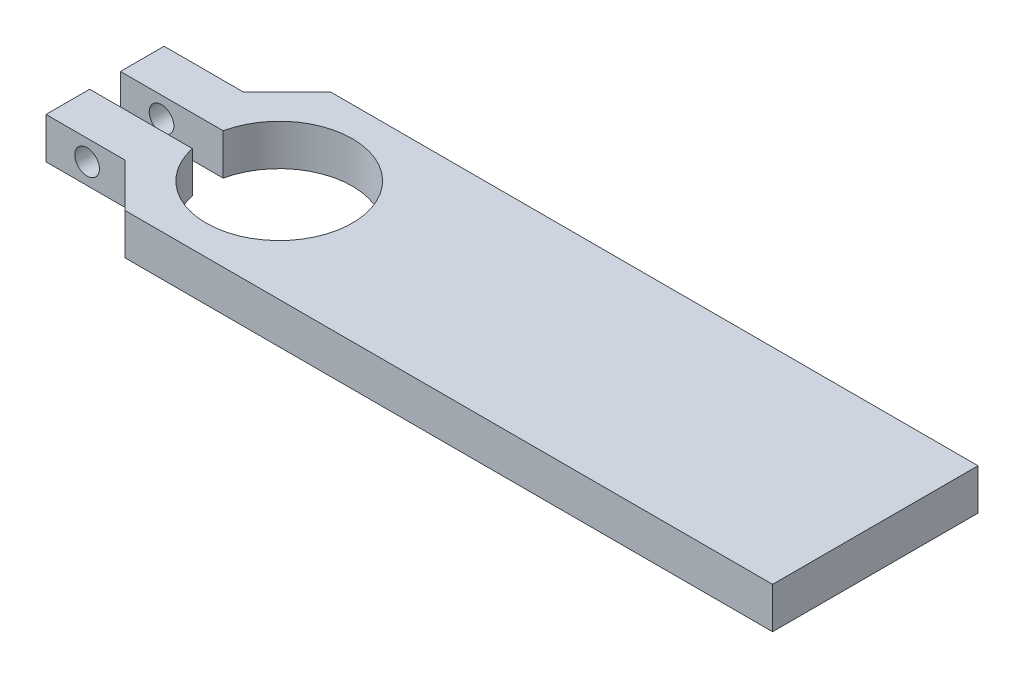
ISO-10303-21;
HEADER;
FILE_DESCRIPTION(('STEP AP214'),'2;1');
FILE_NAME('part.step','',(''),(''),'','','');
FILE_SCHEMA(('AUTOMOTIVE_DESIGN { 1 0 10303 214 1 1 1 1 }'));
ENDSEC;
DATA;
#1=APPLICATION_CONTEXT('core data for automotive mechanical design processes');
#2=APPLICATION_PROTOCOL_DEFINITION('international standard','automotive_design',2000,#1);
#3=PRODUCT_CONTEXT('',#1,'mechanical');
#4=PRODUCT('Part','Part','',(#3));
#5=PRODUCT_RELATED_PRODUCT_CATEGORY('part','',(#4));
#6=PRODUCT_DEFINITION_FORMATION('','',#4);
#7=PRODUCT_DEFINITION_CONTEXT('part definition',#1,'design');
#8=PRODUCT_DEFINITION('design','',#6,#7);
#9=PRODUCT_DEFINITION_SHAPE('','',#8);
#10=(LENGTH_UNIT() NAMED_UNIT(*) SI_UNIT(.MILLI.,.METRE.));
#11=(NAMED_UNIT(*) PLANE_ANGLE_UNIT() SI_UNIT($,.RADIAN.));
#12=(NAMED_UNIT(*) SI_UNIT($,.STERADIAN.) SOLID_ANGLE_UNIT());
#13=UNCERTAINTY_MEASURE_WITH_UNIT(LENGTH_MEASURE(1.E-05),#10,'distance_accuracy_value','');
#14=(GEOMETRIC_REPRESENTATION_CONTEXT(3) GLOBAL_UNCERTAINTY_ASSIGNED_CONTEXT((#13)) GLOBAL_UNIT_ASSIGNED_CONTEXT((#10,
#11,#12)) REPRESENTATION_CONTEXT('',''));
#15=CARTESIAN_POINT('',(0.,0.,0.));
#16=DIRECTION('',(0.,0.,1.));
#17=DIRECTION('',(1.,0.,0.));
#18=AXIS2_PLACEMENT_3D('',#15,#16,#17);
#19=CARTESIAN_POINT('',(0.,4.,0.));
#20=DIRECTION('',(1.,0.,0.));
#21=DIRECTION('',(0.,0.,-1.));
#22=AXIS2_PLACEMENT_3D('',#19,#20,#21);
#23=PLANE('',#22);
#24=DIRECTION('',(0.,0.,1.));
#25=VECTOR('',#24,1.);
#26=CARTESIAN_POINT('',(0.,0.,0.));
#27=LINE('',#26,#25);
#28=CARTESIAN_POINT('',(0.,0.,-8.5));
#29=VERTEX_POINT('',#28);
#30=CARTESIAN_POINT('',(0.,0.,-4.25));
#31=VERTEX_POINT('',#30);
#32=EDGE_CURVE('E159',#29,#31,#27,.T.);
#33=ORIENTED_EDGE('',*,*,#32,.T.);
#34=DIRECTION('',(0.,1.,0.));
#35=VECTOR('',#34,1.);
#36=CARTESIAN_POINT('',(0.,0.,-4.25));
#37=LINE('',#36,#35);
#38=CARTESIAN_POINT('',(0.,4.,-4.25));
#39=VERTEX_POINT('',#38);
#40=EDGE_CURVE('E223',#31,#39,#37,.T.);
#41=ORIENTED_EDGE('',*,*,#40,.T.);
#42=DIRECTION('',(0.,0.,1.));
#43=VECTOR('',#42,1.);
#44=CARTESIAN_POINT('',(0.,4.,0.));
#45=LINE('',#44,#43);
#46=CARTESIAN_POINT('',(0.,4.,-8.5));
#47=VERTEX_POINT('',#46);
#48=EDGE_CURVE('E177',#47,#39,#45,.T.);
#49=ORIENTED_EDGE('',*,*,#48,.F.);
#50=DIRECTION('',(0.,-1.,0.));
#51=VECTOR('',#50,1.);
#52=CARTESIAN_POINT('',(0.,4.000012,-8.5));
#53=LINE('',#52,#51);
#54=EDGE_CURVE('E186',#47,#29,#53,.T.);
#55=ORIENTED_EDGE('',*,*,#54,.T.);
#56=EDGE_LOOP('',(#33,#41,#49,#55));
#57=FACE_BOUND('',#56,.T.);
#58=ADVANCED_FACE('F39',(#57),#23,.F.);
#59=CARTESIAN_POINT('',(0.,4.,-15.75));
#60=VERTEX_POINT('',#59);
#61=CARTESIAN_POINT('',(0.,4.,-11.5));
#62=VERTEX_POINT('',#61);
#63=EDGE_CURVE('E150',#60,#62,#45,.T.);
#64=ORIENTED_EDGE('',*,*,#63,.F.);
#65=DIRECTION('',(0.,1.,0.));
#66=VECTOR('',#65,1.);
#67=CARTESIAN_POINT('',(0.,0.,-15.75));
#68=LINE('',#67,#66);
#69=CARTESIAN_POINT('',(0.,0.,-15.75));
#70=VERTEX_POINT('',#69);
#71=EDGE_CURVE('E134',#70,#60,#68,.T.);
#72=ORIENTED_EDGE('',*,*,#71,.F.);
#73=CARTESIAN_POINT('',(0.,0.,-11.5));
#74=VERTEX_POINT('',#73);
#75=EDGE_CURVE('E148',#70,#74,#27,.T.);
#76=ORIENTED_EDGE('',*,*,#75,.T.);
#77=DIRECTION('',(0.,-1.,0.));
#78=VECTOR('',#77,1.);
#79=CARTESIAN_POINT('',(0.,4.000012,-11.5));
#80=LINE('',#79,#78);
#81=EDGE_CURVE('E252',#62,#74,#80,.T.);
#82=ORIENTED_EDGE('',*,*,#81,.F.);
#83=EDGE_LOOP('',(#64,#72,#76,#82));
#84=FACE_BOUND('',#83,.T.);
#85=ADVANCED_FACE('F146',(#84),#23,.F.);
#86=CARTESIAN_POINT('',(0.,4.,0.));
#87=DIRECTION('',(0.,-1.,0.));
#88=DIRECTION('',(0.,0.,-1.));
#89=AXIS2_PLACEMENT_3D('',#86,#87,#88);
#90=PLANE('',#89);
#91=DIRECTION('',(-1.,0.,0.));
#92=VECTOR('',#91,1.);
#93=CARTESIAN_POINT('',(0.,4.,-20.));
#94=LINE('',#93,#92);
#95=CARTESIAN_POINT('',(75.,4.,-20.));
#96=VERTEX_POINT('',#95);
#97=CARTESIAN_POINT('',(11.9412531141164,4.,-20.));
#98=VERTEX_POINT('',#97);
#99=EDGE_CURVE('E168',#96,#98,#94,.T.);
#100=ORIENTED_EDGE('',*,*,#99,.T.);
#101=DIRECTION('',(0.707106781186547,0.,-0.707106781186548));
#102=VECTOR('',#101,1.);
#103=CARTESIAN_POINT('',(7.69125311411642,4.,-15.75));
#104=LINE('',#103,#102);
#105=CARTESIAN_POINT('',(7.69125311411642,4.,-15.75));
#106=VERTEX_POINT('',#105);
#107=EDGE_CURVE('E64',#106,#98,#104,.T.);
#108=ORIENTED_EDGE('',*,*,#107,.F.);
#109=DIRECTION('',(1.,0.,0.));
#110=VECTOR('',#109,1.);
#111=CARTESIAN_POINT('',(0.,4.,-15.75));
#112=LINE('',#111,#110);
#113=EDGE_CURVE('E227',#60,#106,#112,.T.);
#114=ORIENTED_EDGE('',*,*,#113,.F.);
#115=ORIENTED_EDGE('',*,*,#63,.T.);
#116=DIRECTION('',(-1.,0.,0.));
#117=VECTOR('',#116,1.);
#118=CARTESIAN_POINT('',(0.,4.,-11.5));
#119=LINE('',#118,#117);
#120=CARTESIAN_POINT('',(10.,4.,-11.5));
#121=VERTEX_POINT('',#120);
#122=EDGE_CURVE('E185',#121,#62,#119,.T.);
#123=ORIENTED_EDGE('',*,*,#122,.F.);
#124=CARTESIAN_POINT('',(16.9602011465187,4.,-10.));
#125=DIRECTION('',(0.,1.,0.));
#126=DIRECTION('',(0.,0.,1.));
#127=AXIS2_PLACEMENT_3D('',#124,#125,#126);
#128=CIRCLE('',#127,7.12);
#129=CARTESIAN_POINT('',(10.,4.,-8.5));
#130=VERTEX_POINT('',#129);
#131=EDGE_CURVE('E181',#130,#121,#128,.T.);
#132=ORIENTED_EDGE('',*,*,#131,.F.);
#133=DIRECTION('',(1.,0.,0.));
#134=VECTOR('',#133,1.);
#135=CARTESIAN_POINT('',(0.,4.,-8.5));
#136=LINE('',#135,#134);
#137=EDGE_CURVE('E166',#47,#130,#136,.T.);
#138=ORIENTED_EDGE('',*,*,#137,.F.);
#139=ORIENTED_EDGE('',*,*,#48,.T.);
#140=DIRECTION('',(-1.,0.,0.));
#141=VECTOR('',#140,1.);
#142=CARTESIAN_POINT('',(0.,4.,-4.25));
#143=LINE('',#142,#141);
#144=CARTESIAN_POINT('',(7.69125311411642,4.,-4.25));
#145=VERTEX_POINT('',#144);
#146=EDGE_CURVE('E212',#145,#39,#143,.T.);
#147=ORIENTED_EDGE('',*,*,#146,.F.);
#148=DIRECTION('',(-0.707106781186547,0.,-0.707106781186548));
#149=VECTOR('',#148,1.);
#150=CARTESIAN_POINT('',(7.69125311411642,4.,-4.25));
#151=LINE('',#150,#149);
#152=CARTESIAN_POINT('',(11.9412531141164,4.,0.));
#153=VERTEX_POINT('',#152);
#154=EDGE_CURVE('E217',#153,#145,#151,.T.);
#155=ORIENTED_EDGE('',*,*,#154,.F.);
#156=DIRECTION('',(1.,0.,0.));
#157=VECTOR('',#156,1.);
#158=CARTESIAN_POINT('',(0.,4.,0.));
#159=LINE('',#158,#157);
#160=CARTESIAN_POINT('',(75.,4.,0.));
#161=VERTEX_POINT('',#160);
#162=EDGE_CURVE('E265',#153,#161,#159,.T.);
#163=ORIENTED_EDGE('',*,*,#162,.T.);
#164=DIRECTION('',(0.,0.,-1.));
#165=VECTOR('',#164,1.);
#166=CARTESIAN_POINT('',(75.,4.,0.));
#167=LINE('',#166,#165);
#168=EDGE_CURVE('E267',#161,#96,#167,.T.);
#169=ORIENTED_EDGE('',*,*,#168,.T.);
#170=EDGE_LOOP('',(#100,#108,#114,#115,#123,#132,#138,#139,#147,#155,#163,#169));
#171=FACE_BOUND('',#170,.T.);
#172=ADVANCED_FACE('F273',(#171),#90,.F.);
#173=CARTESIAN_POINT('',(0.,0.,0.));
#174=DIRECTION('',(0.,-1.,0.));
#175=DIRECTION('',(0.,0.,-1.));
#176=AXIS2_PLACEMENT_3D('',#173,#174,#175);
#177=PLANE('',#176);
#178=DIRECTION('',(0.707106781186547,0.,-0.707106781186548));
#179=VECTOR('',#178,1.);
#180=CARTESIAN_POINT('',(7.69125311411642,0.,-15.75));
#181=LINE('',#180,#179);
#182=CARTESIAN_POINT('',(7.69125311411642,0.,-15.75));
#183=VERTEX_POINT('',#182);
#184=CARTESIAN_POINT('',(11.9412531141164,0.,-20.));
#185=VERTEX_POINT('',#184);
#186=EDGE_CURVE('E142',#183,#185,#181,.T.);
#187=ORIENTED_EDGE('',*,*,#186,.T.);
#188=DIRECTION('',(-1.,0.,0.));
#189=VECTOR('',#188,1.);
#190=CARTESIAN_POINT('',(0.,0.,-20.));
#191=LINE('',#190,#189);
#192=CARTESIAN_POINT('',(75.,0.,-20.));
#193=VERTEX_POINT('',#192);
#194=EDGE_CURVE('E173',#193,#185,#191,.T.);
#195=ORIENTED_EDGE('',*,*,#194,.F.);
#196=DIRECTION('',(0.,0.,-1.));
#197=VECTOR('',#196,1.);
#198=CARTESIAN_POINT('',(75.,0.,0.));
#199=LINE('',#198,#197);
#200=CARTESIAN_POINT('',(75.,0.,0.));
#201=VERTEX_POINT('',#200);
#202=EDGE_CURVE('E163',#201,#193,#199,.T.);
#203=ORIENTED_EDGE('',*,*,#202,.F.);
#204=DIRECTION('',(1.,0.,0.));
#205=VECTOR('',#204,1.);
#206=CARTESIAN_POINT('',(0.,0.,0.));
#207=LINE('',#206,#205);
#208=CARTESIAN_POINT('',(11.9412531141164,0.,0.));
#209=VERTEX_POINT('',#208);
#210=EDGE_CURVE('E158',#209,#201,#207,.T.);
#211=ORIENTED_EDGE('',*,*,#210,.F.);
#212=DIRECTION('',(-0.707106781186547,0.,-0.707106781186548));
#213=VECTOR('',#212,1.);
#214=CARTESIAN_POINT('',(7.69125311411642,0.,-4.25));
#215=LINE('',#214,#213);
#216=CARTESIAN_POINT('',(7.69125311411642,0.,-4.25));
#217=VERTEX_POINT('',#216);
#218=EDGE_CURVE('E56',#209,#217,#215,.T.);
#219=ORIENTED_EDGE('',*,*,#218,.T.);
#220=DIRECTION('',(-1.,0.,0.));
#221=VECTOR('',#220,1.);
#222=CARTESIAN_POINT('',(0.,0.,-4.25));
#223=LINE('',#222,#221);
#224=EDGE_CURVE('E211',#217,#31,#223,.T.);
#225=ORIENTED_EDGE('',*,*,#224,.T.);
#226=ORIENTED_EDGE('',*,*,#32,.F.);
#227=DIRECTION('',(1.,0.,0.));
#228=VECTOR('',#227,1.);
#229=CARTESIAN_POINT('',(0.,0.,-8.5));
#230=LINE('',#229,#228);
#231=CARTESIAN_POINT('',(10.,0.,-8.5));
#232=VERTEX_POINT('',#231);
#233=EDGE_CURVE('E236',#29,#232,#230,.T.);
#234=ORIENTED_EDGE('',*,*,#233,.T.);
#235=CARTESIAN_POINT('',(16.9602011465187,0.,-10.));
#236=DIRECTION('',(0.,1.,0.));
#237=DIRECTION('',(0.,0.,-1.));
#238=AXIS2_PLACEMENT_3D('',#235,#236,#237);
#239=CIRCLE('',#238,7.12);
#240=CARTESIAN_POINT('',(10.,0.,-11.5));
#241=VERTEX_POINT('',#240);
#242=EDGE_CURVE('E240',#232,#241,#239,.T.);
#243=ORIENTED_EDGE('',*,*,#242,.T.);
#244=DIRECTION('',(-1.,0.,0.));
#245=VECTOR('',#244,1.);
#246=CARTESIAN_POINT('',(0.,0.,-11.5));
#247=LINE('',#246,#245);
#248=EDGE_CURVE('E156',#241,#74,#247,.T.);
#249=ORIENTED_EDGE('',*,*,#248,.T.);
#250=ORIENTED_EDGE('',*,*,#75,.F.);
#251=DIRECTION('',(1.,0.,0.));
#252=VECTOR('',#251,1.);
#253=CARTESIAN_POINT('',(0.,0.,-15.75));
#254=LINE('',#253,#252);
#255=EDGE_CURVE('E129',#70,#183,#254,.T.);
#256=ORIENTED_EDGE('',*,*,#255,.T.);
#257=EDGE_LOOP('',(#187,#195,#203,#211,#219,#225,#226,#234,#243,#249,#250,#256));
#258=FACE_BOUND('',#257,.T.);
#259=ADVANCED_FACE('F154',(#258),#177,.T.);
#260=CARTESIAN_POINT('',(0.,4.,0.));
#261=DIRECTION('',(0.,0.,-1.));
#262=DIRECTION('',(-1.,0.,0.));
#263=AXIS2_PLACEMENT_3D('',#260,#261,#262);
#264=PLANE('',#263);
#265=ORIENTED_EDGE('',*,*,#162,.F.);
#266=DIRECTION('',(0.,1.,0.));
#267=VECTOR('',#266,1.);
#268=CARTESIAN_POINT('',(11.9412531141164,0.,0.));
#269=LINE('',#268,#267);
#270=EDGE_CURVE('E216',#209,#153,#269,.T.);
#271=ORIENTED_EDGE('',*,*,#270,.F.);
#272=ORIENTED_EDGE('',*,*,#210,.T.);
#273=DIRECTION('',(0.,-1.,0.));
#274=VECTOR('',#273,1.);
#275=CARTESIAN_POINT('',(75.,4.,0.));
#276=LINE('',#275,#274);
#277=EDGE_CURVE('E11',#161,#201,#276,.T.);
#278=ORIENTED_EDGE('',*,*,#277,.F.);
#279=EDGE_LOOP('',(#265,#271,#272,#278));
#280=FACE_BOUND('',#279,.T.);
#281=ADVANCED_FACE('F306',(#280),#264,.F.);
#282=CARTESIAN_POINT('',(75.,4.,0.));
#283=DIRECTION('',(-1.,0.,0.));
#284=DIRECTION('',(0.,0.,1.));
#285=AXIS2_PLACEMENT_3D('',#282,#283,#284);
#286=PLANE('',#285);
#287=ORIENTED_EDGE('',*,*,#202,.T.);
#288=DIRECTION('',(0.,-1.,0.));
#289=VECTOR('',#288,1.);
#290=CARTESIAN_POINT('',(75.,4.,-20.));
#291=LINE('',#290,#289);
#292=EDGE_CURVE('E48',#96,#193,#291,.T.);
#293=ORIENTED_EDGE('',*,*,#292,.F.);
#294=ORIENTED_EDGE('',*,*,#168,.F.);
#295=ORIENTED_EDGE('',*,*,#277,.T.);
#296=EDGE_LOOP('',(#287,#293,#294,#295));
#297=FACE_BOUND('',#296,.T.);
#298=ADVANCED_FACE('F307',(#297),#286,.F.);
#299=CARTESIAN_POINT('',(0.,4.,-20.));
#300=DIRECTION('',(0.,0.,1.));
#301=DIRECTION('',(1.,0.,0.));
#302=AXIS2_PLACEMENT_3D('',#299,#300,#301);
#303=PLANE('',#302);
#304=ORIENTED_EDGE('',*,*,#194,.T.);
#305=DIRECTION('',(0.,1.,0.));
#306=VECTOR('',#305,1.);
#307=CARTESIAN_POINT('',(11.9412531141164,0.,-20.));
#308=LINE('',#307,#306);
#309=EDGE_CURVE('E194',#185,#98,#308,.T.);
#310=ORIENTED_EDGE('',*,*,#309,.T.);
#311=ORIENTED_EDGE('',*,*,#99,.F.);
#312=ORIENTED_EDGE('',*,*,#292,.T.);
#313=EDGE_LOOP('',(#304,#310,#311,#312));
#314=FACE_BOUND('',#313,.T.);
#315=ADVANCED_FACE('F274',(#314),#303,.F.);
#316=CARTESIAN_POINT('',(0.,4.000012,-8.5));
#317=DIRECTION('',(0.,0.,-1.));
#318=DIRECTION('',(-1.,0.,0.));
#319=AXIS2_PLACEMENT_3D('',#316,#317,#318);
#320=PLANE('',#319);
#321=CARTESIAN_POINT('',(4.,2.,-8.5));
#322=DIRECTION('',(0.,0.,-1.));
#323=DIRECTION('',(-1.,0.,0.));
#324=AXIS2_PLACEMENT_3D('',#321,#322,#323);
#325=CIRCLE('',#324,1.2);
#326=CARTESIAN_POINT('',(2.8,2.,-8.5));
#327=VERTEX_POINT('',#326);
#328=EDGE_CURVE('E190',#327,#327,#325,.T.);
#329=ORIENTED_EDGE('',*,*,#328,.F.);
#330=EDGE_LOOP('',(#329));
#331=FACE_BOUND('',#330,.T.);
#332=ORIENTED_EDGE('',*,*,#137,.T.);
#333=DIRECTION('',(0.,1.,0.));
#334=VECTOR('',#333,1.);
#335=CARTESIAN_POINT('',(10.,0.,-8.5));
#336=LINE('',#335,#334);
#337=EDGE_CURVE('E245',#232,#130,#336,.T.);
#338=ORIENTED_EDGE('',*,*,#337,.F.);
#339=ORIENTED_EDGE('',*,*,#233,.F.);
#340=ORIENTED_EDGE('',*,*,#54,.F.);
#341=EDGE_LOOP('',(#332,#338,#339,#340));
#342=FACE_BOUND('',#341,.T.);
#343=ADVANCED_FACE('F314',(#331,#342),#320,.T.);
#344=CARTESIAN_POINT('',(0.,4.000012,-11.5));
#345=DIRECTION('',(0.,0.,1.));
#346=DIRECTION('',(1.,0.,0.));
#347=AXIS2_PLACEMENT_3D('',#344,#345,#346);
#348=PLANE('',#347);
#349=CARTESIAN_POINT('',(4.,2.,-11.5));
#350=DIRECTION('',(0.,0.,1.));
#351=DIRECTION('',(1.,0.,0.));
#352=AXIS2_PLACEMENT_3D('',#349,#350,#351);
#353=CIRCLE('',#352,1.2);
#354=CARTESIAN_POINT('',(5.2,2.,-11.5));
#355=VERTEX_POINT('',#354);
#356=EDGE_CURVE('E187',#355,#355,#353,.T.);
#357=ORIENTED_EDGE('',*,*,#356,.F.);
#358=EDGE_LOOP('',(#357));
#359=FACE_BOUND('',#358,.T.);
#360=ORIENTED_EDGE('',*,*,#122,.T.);
#361=ORIENTED_EDGE('',*,*,#81,.T.);
#362=ORIENTED_EDGE('',*,*,#248,.F.);
#363=DIRECTION('',(0.,1.,0.));
#364=VECTOR('',#363,1.);
#365=CARTESIAN_POINT('',(10.,0.,-11.5));
#366=LINE('',#365,#364);
#367=EDGE_CURVE('E249',#241,#121,#366,.T.);
#368=ORIENTED_EDGE('',*,*,#367,.T.);
#369=EDGE_LOOP('',(#360,#361,#362,#368));
#370=FACE_BOUND('',#369,.T.);
#371=ADVANCED_FACE('F286',(#359,#370),#348,.T.);
#372=CARTESIAN_POINT('',(16.9602011465187,0.,-10.));
#373=DIRECTION('',(0.,1.,0.));
#374=DIRECTION('',(0.,0.,1.));
#375=AXIS2_PLACEMENT_3D('',#372,#373,#374);
#376=CYLINDRICAL_SURFACE('',#375,7.12);
#377=ORIENTED_EDGE('',*,*,#367,.F.);
#378=ORIENTED_EDGE('',*,*,#242,.F.);
#379=ORIENTED_EDGE('',*,*,#337,.T.);
#380=ORIENTED_EDGE('',*,*,#131,.T.);
#381=EDGE_LOOP('',(#377,#378,#379,#380));
#382=FACE_BOUND('',#381,.T.);
#383=ADVANCED_FACE('F290',(#382),#376,.F.);
#384=CARTESIAN_POINT('',(4.,2.,-20.));
#385=DIRECTION('',(0.,0.,-1.));
#386=DIRECTION('',(-1.,0.,0.));
#387=AXIS2_PLACEMENT_3D('',#384,#385,#386);
#388=CYLINDRICAL_SURFACE('',#387,1.2);
#389=CARTESIAN_POINT('',(4.,2.,-15.75));
#390=DIRECTION('',(0.,0.,1.));
#391=DIRECTION('',(1.,0.,0.));
#392=AXIS2_PLACEMENT_3D('',#389,#390,#391);
#393=CIRCLE('',#392,1.2);
#394=CARTESIAN_POINT('',(5.2,2.,-15.75));
#395=VERTEX_POINT('',#394);
#396=EDGE_CURVE('E42',#395,#395,#393,.F.);
#397=ORIENTED_EDGE('',*,*,#396,.T.);
#398=EDGE_LOOP('',(#397));
#399=FACE_BOUND('',#398,.T.);
#400=ORIENTED_EDGE('',*,*,#356,.T.);
#401=EDGE_LOOP('',(#400));
#402=FACE_BOUND('',#401,.T.);
#403=ADVANCED_FACE('F337',(#399,#402),#388,.F.);
#404=CARTESIAN_POINT('',(4.,2.,-4.25));
#405=DIRECTION('',(0.,0.,-1.));
#406=DIRECTION('',(-1.,0.,0.));
#407=AXIS2_PLACEMENT_3D('',#404,#405,#406);
#408=CIRCLE('',#407,1.2);
#409=CARTESIAN_POINT('',(2.8,2.,-4.25));
#410=VERTEX_POINT('',#409);
#411=EDGE_CURVE('E191',#410,#410,#408,.F.);
#412=ORIENTED_EDGE('',*,*,#411,.T.);
#413=EDGE_LOOP('',(#412));
#414=FACE_BOUND('',#413,.T.);
#415=ORIENTED_EDGE('',*,*,#328,.T.);
#416=EDGE_LOOP('',(#415));
#417=FACE_BOUND('',#416,.T.);
#418=ADVANCED_FACE('F340',(#414,#417),#388,.F.);
#419=CARTESIAN_POINT('',(0.,0.,-4.25));
#420=DIRECTION('',(0.,0.,-1.));
#421=DIRECTION('',(-1.,0.,0.));
#422=AXIS2_PLACEMENT_3D('',#419,#420,#421);
#423=PLANE('',#422);
#424=ORIENTED_EDGE('',*,*,#146,.T.);
#425=ORIENTED_EDGE('',*,*,#40,.F.);
#426=ORIENTED_EDGE('',*,*,#224,.F.);
#427=DIRECTION('',(0.,1.,0.));
#428=VECTOR('',#427,1.);
#429=CARTESIAN_POINT('',(7.69125311411642,0.,-4.25));
#430=LINE('',#429,#428);
#431=EDGE_CURVE('E228',#217,#145,#430,.T.);
#432=ORIENTED_EDGE('',*,*,#431,.T.);
#433=EDGE_LOOP('',(#424,#425,#426,#432));
#434=FACE_BOUND('',#433,.T.);
#435=ORIENTED_EDGE('',*,*,#411,.F.);
#436=EDGE_LOOP('',(#435));
#437=FACE_BOUND('',#436,.T.);
#438=ADVANCED_FACE('F301',(#434,#437),#423,.F.);
#439=CARTESIAN_POINT('',(7.69125311411642,0.,-4.25));
#440=DIRECTION('',(0.707106781186548,0.,-0.707106781186547));
#441=DIRECTION('',(-0.707106781186547,0.,-0.707106781186548));
#442=AXIS2_PLACEMENT_3D('',#439,#440,#441);
#443=PLANE('',#442);
#444=ORIENTED_EDGE('',*,*,#154,.T.);
#445=ORIENTED_EDGE('',*,*,#431,.F.);
#446=ORIENTED_EDGE('',*,*,#218,.F.);
#447=ORIENTED_EDGE('',*,*,#270,.T.);
#448=EDGE_LOOP('',(#444,#445,#446,#447));
#449=FACE_BOUND('',#448,.T.);
#450=ADVANCED_FACE('F342',(#449),#443,.F.);
#451=CARTESIAN_POINT('',(0.,0.,-15.75));
#452=DIRECTION('',(0.,0.,1.));
#453=DIRECTION('',(1.,0.,0.));
#454=AXIS2_PLACEMENT_3D('',#451,#452,#453);
#455=PLANE('',#454);
#456=ORIENTED_EDGE('',*,*,#113,.T.);
#457=DIRECTION('',(0.,1.,0.));
#458=VECTOR('',#457,1.);
#459=CARTESIAN_POINT('',(7.69125311411642,0.,-15.75));
#460=LINE('',#459,#458);
#461=EDGE_CURVE('E136',#183,#106,#460,.T.);
#462=ORIENTED_EDGE('',*,*,#461,.F.);
#463=ORIENTED_EDGE('',*,*,#255,.F.);
#464=ORIENTED_EDGE('',*,*,#71,.T.);
#465=EDGE_LOOP('',(#456,#462,#463,#464));
#466=FACE_BOUND('',#465,.T.);
#467=ORIENTED_EDGE('',*,*,#396,.F.);
#468=EDGE_LOOP('',(#467));
#469=FACE_BOUND('',#468,.T.);
#470=ADVANCED_FACE('F132',(#466,#469),#455,.F.);
#471=CARTESIAN_POINT('',(7.69125311411642,0.,-15.75));
#472=DIRECTION('',(0.707106781186548,0.,0.707106781186547));
#473=DIRECTION('',(0.707106781186547,0.,-0.707106781186548));
#474=AXIS2_PLACEMENT_3D('',#471,#472,#473);
#475=PLANE('',#474);
#476=ORIENTED_EDGE('',*,*,#107,.T.);
#477=ORIENTED_EDGE('',*,*,#309,.F.);
#478=ORIENTED_EDGE('',*,*,#186,.F.);
#479=ORIENTED_EDGE('',*,*,#461,.T.);
#480=EDGE_LOOP('',(#476,#477,#478,#479));
#481=FACE_BOUND('',#480,.T.);
#482=ADVANCED_FACE('F349',(#481),#475,.F.);
#483=CLOSED_SHELL('',(#58,#85,#172,#259,#281,#298,#315,#343,#371,#383,#403,#418,#438,#450,#470,#482));
#484=MANIFOLD_SOLID_BREP('B2',#483);
#485=ADVANCED_BREP_SHAPE_REPRESENTATION('',(#18,#484),#14);
#486=SHAPE_DEFINITION_REPRESENTATION(#9,#485);
ENDSEC;
END-ISO-10303-21;
